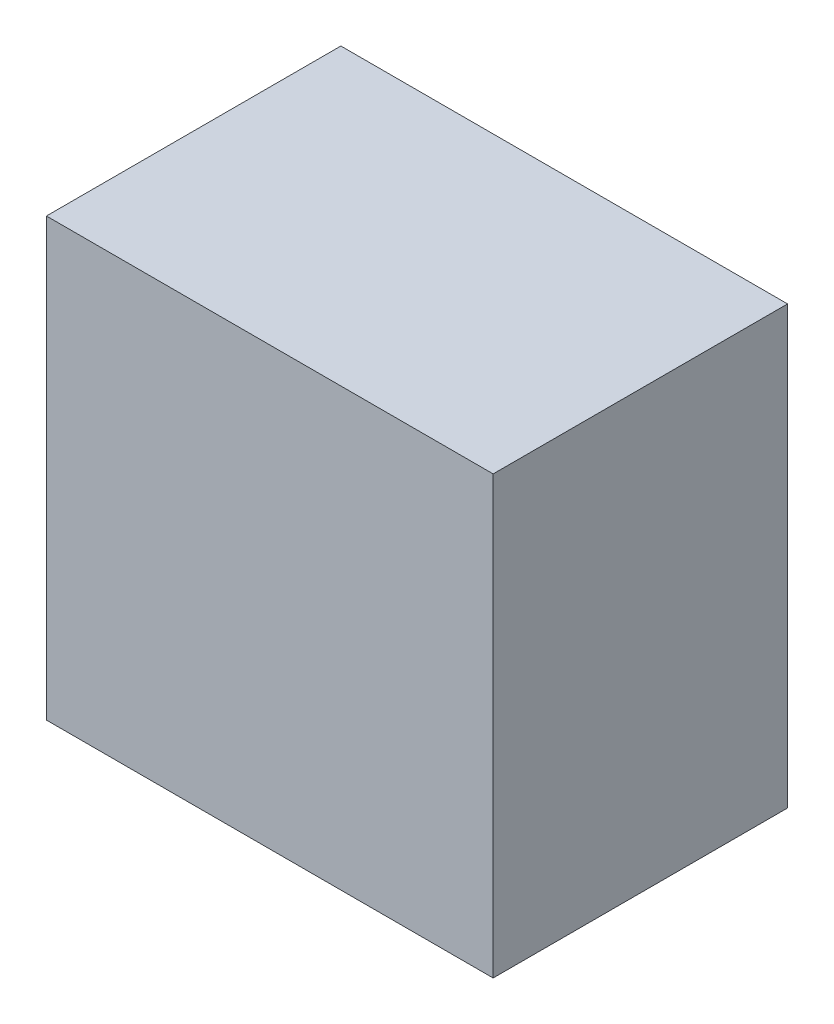
ISO-10303-21;
HEADER;
FILE_DESCRIPTION(('STEP AP214'),'2;1');
FILE_NAME('part.step','',(''),(''),'','','');
FILE_SCHEMA(('AUTOMOTIVE_DESIGN { 1 0 10303 214 1 1 1 1 }'));
ENDSEC;
DATA;
#1=APPLICATION_CONTEXT('core data for automotive mechanical design processes');
#2=APPLICATION_PROTOCOL_DEFINITION('international standard','automotive_design',2000,#1);
#3=PRODUCT_CONTEXT('',#1,'mechanical');
#4=PRODUCT('Part','Part','',(#3));
#5=PRODUCT_RELATED_PRODUCT_CATEGORY('part','',(#4));
#6=PRODUCT_DEFINITION_FORMATION('','',#4);
#7=PRODUCT_DEFINITION_CONTEXT('part definition',#1,'design');
#8=PRODUCT_DEFINITION('design','',#6,#7);
#9=PRODUCT_DEFINITION_SHAPE('','',#8);
#10=(LENGTH_UNIT() NAMED_UNIT(*) SI_UNIT(.MILLI.,.METRE.));
#11=(NAMED_UNIT(*) PLANE_ANGLE_UNIT() SI_UNIT($,.RADIAN.));
#12=(NAMED_UNIT(*) SI_UNIT($,.STERADIAN.) SOLID_ANGLE_UNIT());
#13=UNCERTAINTY_MEASURE_WITH_UNIT(LENGTH_MEASURE(1.E-05),#10,'distance_accuracy_value','');
#14=(GEOMETRIC_REPRESENTATION_CONTEXT(3) GLOBAL_UNCERTAINTY_ASSIGNED_CONTEXT((#13)) GLOBAL_UNIT_ASSIGNED_CONTEXT((#10,
#11,#12)) REPRESENTATION_CONTEXT('',''));
#15=CARTESIAN_POINT('',(0.,0.,0.));
#16=DIRECTION('',(0.,0.,1.));
#17=DIRECTION('',(1.,0.,0.));
#18=AXIS2_PLACEMENT_3D('',#15,#16,#17);
#19=CARTESIAN_POINT('',(0.,0.,-58.));
#20=DIRECTION('',(-1.,0.,0.));
#21=DIRECTION('',(0.,0.,1.));
#22=AXIS2_PLACEMENT_3D('',#19,#20,#21);
#23=PLANE('',#22);
#24=DIRECTION('',(0.,-1.,0.));
#25=VECTOR('',#24,1.);
#26=CARTESIAN_POINT('',(0.,0.,0.));
#27=LINE('',#26,#25);
#28=CARTESIAN_POINT('',(0.,86.,0.));
#29=VERTEX_POINT('',#28);
#30=CARTESIAN_POINT('',(0.,0.,0.));
#31=VERTEX_POINT('',#30);
#32=EDGE_CURVE('E99',#29,#31,#27,.T.);
#33=ORIENTED_EDGE('',*,*,#32,.F.);
#34=DIRECTION('',(0.,0.,1.));
#35=VECTOR('',#34,1.);
#36=CARTESIAN_POINT('',(0.,86.,-58.));
#37=LINE('',#36,#35);
#38=CARTESIAN_POINT('',(0.,86.,-58.));
#39=VERTEX_POINT('',#38);
#40=EDGE_CURVE('E11',#39,#29,#37,.T.);
#41=ORIENTED_EDGE('',*,*,#40,.F.);
#42=DIRECTION('',(0.,-1.,0.));
#43=VECTOR('',#42,1.);
#44=CARTESIAN_POINT('',(0.,0.,-58.));
#45=LINE('',#44,#43);
#46=CARTESIAN_POINT('',(0.,0.,-58.));
#47=VERTEX_POINT('',#46);
#48=EDGE_CURVE('E93',#39,#47,#45,.T.);
#49=ORIENTED_EDGE('',*,*,#48,.T.);
#50=DIRECTION('',(0.,0.,1.));
#51=VECTOR('',#50,1.);
#52=CARTESIAN_POINT('',(0.,0.,-58.));
#53=LINE('',#52,#51);
#54=EDGE_CURVE('E38',#47,#31,#53,.T.);
#55=ORIENTED_EDGE('',*,*,#54,.T.);
#56=EDGE_LOOP('',(#33,#41,#49,#55));
#57=FACE_BOUND('',#56,.T.);
#58=ADVANCED_FACE('F35',(#57),#23,.T.);
#59=CARTESIAN_POINT('',(0.,86.,-58.));
#60=DIRECTION('',(0.,1.,0.));
#61=DIRECTION('',(0.,0.,1.));
#62=AXIS2_PLACEMENT_3D('',#59,#60,#61);
#63=PLANE('',#62);
#64=DIRECTION('',(-1.,0.,0.));
#65=VECTOR('',#64,1.);
#66=CARTESIAN_POINT('',(0.,86.,0.));
#67=LINE('',#66,#65);
#68=CARTESIAN_POINT('',(88.,86.,0.));
#69=VERTEX_POINT('',#68);
#70=EDGE_CURVE('E95',#69,#29,#67,.T.);
#71=ORIENTED_EDGE('',*,*,#70,.F.);
#72=DIRECTION('',(0.,0.,1.));
#73=VECTOR('',#72,1.);
#74=CARTESIAN_POINT('',(88.,86.,-58.));
#75=LINE('',#74,#73);
#76=CARTESIAN_POINT('',(88.,86.,-58.));
#77=VERTEX_POINT('',#76);
#78=EDGE_CURVE('E44',#77,#69,#75,.T.);
#79=ORIENTED_EDGE('',*,*,#78,.F.);
#80=DIRECTION('',(-1.,0.,0.));
#81=VECTOR('',#80,1.);
#82=CARTESIAN_POINT('',(0.,86.,-58.));
#83=LINE('',#82,#81);
#84=EDGE_CURVE('E90',#77,#39,#83,.T.);
#85=ORIENTED_EDGE('',*,*,#84,.T.);
#86=ORIENTED_EDGE('',*,*,#40,.T.);
#87=EDGE_LOOP('',(#71,#79,#85,#86));
#88=FACE_BOUND('',#87,.T.);
#89=ADVANCED_FACE('F109',(#88),#63,.T.);
#90=CARTESIAN_POINT('',(88.,0.,-58.));
#91=DIRECTION('',(1.,0.,0.));
#92=DIRECTION('',(0.,0.,-1.));
#93=AXIS2_PLACEMENT_3D('',#90,#91,#92);
#94=PLANE('',#93);
#95=DIRECTION('',(0.,1.,0.));
#96=VECTOR('',#95,1.);
#97=CARTESIAN_POINT('',(88.,0.,0.));
#98=LINE('',#97,#96);
#99=CARTESIAN_POINT('',(88.,0.,0.));
#100=VERTEX_POINT('',#99);
#101=EDGE_CURVE('E85',#100,#69,#98,.T.);
#102=ORIENTED_EDGE('',*,*,#101,.F.);
#103=DIRECTION('',(0.,0.,1.));
#104=VECTOR('',#103,1.);
#105=CARTESIAN_POINT('',(88.,0.,-58.));
#106=LINE('',#105,#104);
#107=CARTESIAN_POINT('',(88.,0.,-58.));
#108=VERTEX_POINT('',#107);
#109=EDGE_CURVE('E80',#108,#100,#106,.T.);
#110=ORIENTED_EDGE('',*,*,#109,.F.);
#111=DIRECTION('',(0.,1.,0.));
#112=VECTOR('',#111,1.);
#113=CARTESIAN_POINT('',(88.,0.,-58.));
#114=LINE('',#113,#112);
#115=EDGE_CURVE('E83',#108,#77,#114,.T.);
#116=ORIENTED_EDGE('',*,*,#115,.T.);
#117=ORIENTED_EDGE('',*,*,#78,.T.);
#118=EDGE_LOOP('',(#102,#110,#116,#117));
#119=FACE_BOUND('',#118,.T.);
#120=ADVANCED_FACE('F82',(#119),#94,.T.);
#121=CARTESIAN_POINT('',(0.,0.,-58.));
#122=DIRECTION('',(0.,-1.,0.));
#123=DIRECTION('',(0.,0.,-1.));
#124=AXIS2_PLACEMENT_3D('',#121,#122,#123);
#125=PLANE('',#124);
#126=DIRECTION('',(1.,0.,0.));
#127=VECTOR('',#126,1.);
#128=CARTESIAN_POINT('',(0.,0.,0.));
#129=LINE('',#128,#127);
#130=EDGE_CURVE('E102',#31,#100,#129,.T.);
#131=ORIENTED_EDGE('',*,*,#130,.F.);
#132=ORIENTED_EDGE('',*,*,#54,.F.);
#133=DIRECTION('',(1.,0.,0.));
#134=VECTOR('',#133,1.);
#135=CARTESIAN_POINT('',(0.,0.,-58.));
#136=LINE('',#135,#134);
#137=EDGE_CURVE('E89',#47,#108,#136,.T.);
#138=ORIENTED_EDGE('',*,*,#137,.T.);
#139=ORIENTED_EDGE('',*,*,#109,.T.);
#140=EDGE_LOOP('',(#131,#132,#138,#139));
#141=FACE_BOUND('',#140,.T.);
#142=ADVANCED_FACE('F92',(#141),#125,.T.);
#143=CARTESIAN_POINT('',(0.,0.,-58.));
#144=DIRECTION('',(0.,0.,-1.));
#145=DIRECTION('',(-1.,0.,0.));
#146=AXIS2_PLACEMENT_3D('',#143,#144,#145);
#147=PLANE('',#146);
#148=ORIENTED_EDGE('',*,*,#48,.F.);
#149=ORIENTED_EDGE('',*,*,#84,.F.);
#150=ORIENTED_EDGE('',*,*,#115,.F.);
#151=ORIENTED_EDGE('',*,*,#137,.F.);
#152=EDGE_LOOP('',(#148,#149,#150,#151));
#153=FACE_BOUND('',#152,.T.);
#154=ADVANCED_FACE('F88',(#153),#147,.T.);
#155=CARTESIAN_POINT('',(0.,0.,0.));
#156=DIRECTION('',(0.,0.,-1.));
#157=DIRECTION('',(-1.,0.,0.));
#158=AXIS2_PLACEMENT_3D('',#155,#156,#157);
#159=PLANE('',#158);
#160=ORIENTED_EDGE('',*,*,#32,.T.);
#161=ORIENTED_EDGE('',*,*,#130,.T.);
#162=ORIENTED_EDGE('',*,*,#101,.T.);
#163=ORIENTED_EDGE('',*,*,#70,.T.);
#164=EDGE_LOOP('',(#160,#161,#162,#163));
#165=FACE_BOUND('',#164,.T.);
#166=ADVANCED_FACE('F108',(#165),#159,.F.);
#167=CLOSED_SHELL('',(#58,#89,#120,#142,#154,#166));
#168=MANIFOLD_SOLID_BREP('B2',#167);
#169=ADVANCED_BREP_SHAPE_REPRESENTATION('',(#18,#168),#14);
#170=SHAPE_DEFINITION_REPRESENTATION(#9,#169);
ENDSEC;
END-ISO-10303-21;
